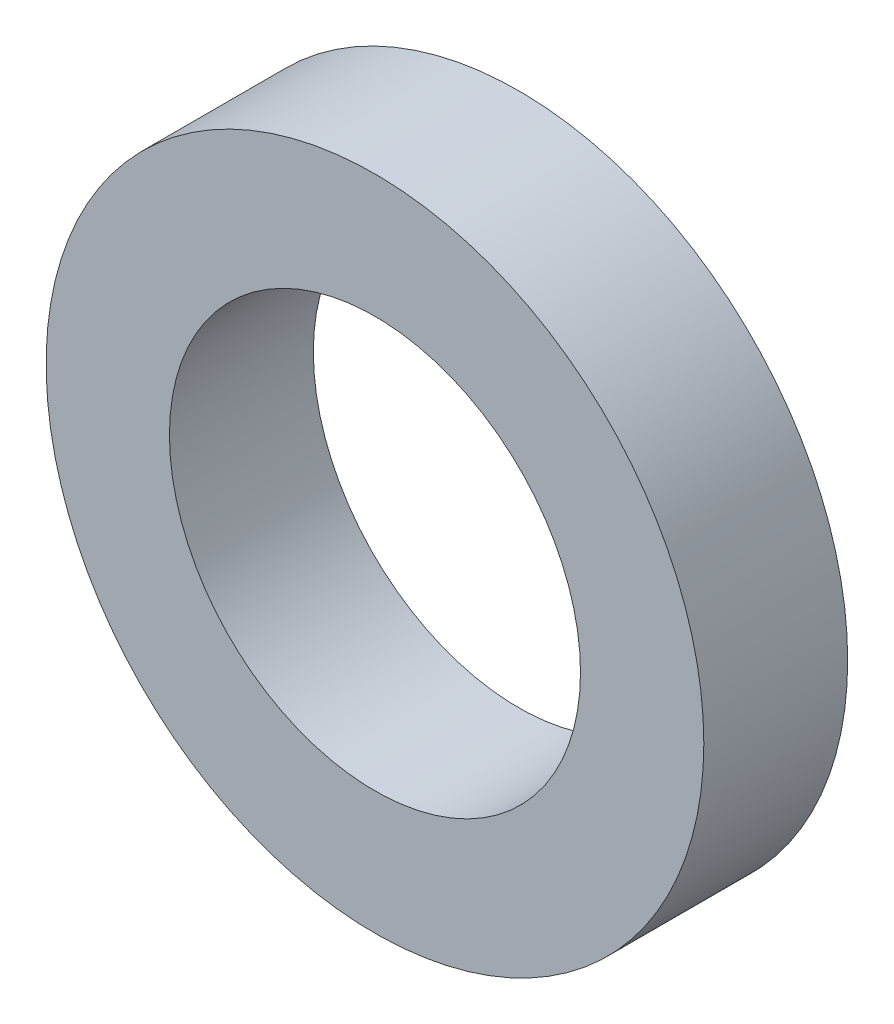
ISO-10303-21;
HEADER;
FILE_DESCRIPTION(('STEP AP214'),'2;1');
FILE_NAME('part.step','',(''),(''),'','','');
FILE_SCHEMA(('AUTOMOTIVE_DESIGN { 1 0 10303 214 1 1 1 1 }'));
ENDSEC;
DATA;
#1=APPLICATION_CONTEXT('core data for automotive mechanical design processes');
#2=APPLICATION_PROTOCOL_DEFINITION('international standard','automotive_design',2000,#1);
#3=PRODUCT_CONTEXT('',#1,'mechanical');
#4=PRODUCT('Part','Part','',(#3));
#5=PRODUCT_RELATED_PRODUCT_CATEGORY('part','',(#4));
#6=PRODUCT_DEFINITION_FORMATION('','',#4);
#7=PRODUCT_DEFINITION_CONTEXT('part definition',#1,'design');
#8=PRODUCT_DEFINITION('design','',#6,#7);
#9=PRODUCT_DEFINITION_SHAPE('','',#8);
#10=(LENGTH_UNIT() NAMED_UNIT(*) SI_UNIT(.MILLI.,.METRE.));
#11=(NAMED_UNIT(*) PLANE_ANGLE_UNIT() SI_UNIT($,.RADIAN.));
#12=(NAMED_UNIT(*) SI_UNIT($,.STERADIAN.) SOLID_ANGLE_UNIT());
#13=UNCERTAINTY_MEASURE_WITH_UNIT(LENGTH_MEASURE(1.E-05),#10,'distance_accuracy_value','');
#14=(GEOMETRIC_REPRESENTATION_CONTEXT(3) GLOBAL_UNCERTAINTY_ASSIGNED_CONTEXT((#13)) GLOBAL_UNIT_ASSIGNED_CONTEXT((#10,
#11,#12)) REPRESENTATION_CONTEXT('',''));
#15=CARTESIAN_POINT('',(0.,0.,0.));
#16=DIRECTION('',(0.,0.,1.));
#17=DIRECTION('',(1.,0.,0.));
#18=AXIS2_PLACEMENT_3D('',#15,#16,#17);
#19=CARTESIAN_POINT('',(0.,0.,7.));
#20=DIRECTION('',(0.,0.,1.));
#21=DIRECTION('',(1.,0.,0.));
#22=AXIS2_PLACEMENT_3D('',#19,#20,#21);
#23=PLANE('',#22);
#24=CARTESIAN_POINT('',(0.,0.,7.));
#25=DIRECTION('',(0.,0.,1.));
#26=DIRECTION('',(1.,0.,0.));
#27=AXIS2_PLACEMENT_3D('',#24,#25,#26);
#28=CIRCLE('',#27,16.);
#29=CARTESIAN_POINT('',(16.,0.,7.));
#30=VERTEX_POINT('',#29);
#31=EDGE_CURVE('E10',#30,#30,#28,.T.);
#32=ORIENTED_EDGE('',*,*,#31,.T.);
#33=EDGE_LOOP('',(#32));
#34=FACE_BOUND('',#33,.T.);
#35=CARTESIAN_POINT('',(0.,0.,7.));
#36=DIRECTION('',(0.,0.,1.));
#37=DIRECTION('',(1.,0.,0.));
#38=AXIS2_PLACEMENT_3D('',#35,#36,#37);
#39=CIRCLE('',#38,10.);
#40=CARTESIAN_POINT('',(10.,0.,7.));
#41=VERTEX_POINT('',#40);
#42=EDGE_CURVE('E41',#41,#41,#39,.T.);
#43=ORIENTED_EDGE('',*,*,#42,.F.);
#44=EDGE_LOOP('',(#43));
#45=FACE_BOUND('',#44,.T.);
#46=ADVANCED_FACE('F30',(#34,#45),#23,.T.);
#47=CARTESIAN_POINT('',(0.,0.,0.));
#48=DIRECTION('',(0.,0.,1.));
#49=DIRECTION('',(1.,0.,0.));
#50=AXIS2_PLACEMENT_3D('',#47,#48,#49);
#51=PLANE('',#50);
#52=CARTESIAN_POINT('',(0.,0.,0.));
#53=DIRECTION('',(0.,0.,1.));
#54=DIRECTION('',(1.,0.,0.));
#55=AXIS2_PLACEMENT_3D('',#52,#53,#54);
#56=CIRCLE('',#55,16.);
#57=CARTESIAN_POINT('',(16.,0.,0.));
#58=VERTEX_POINT('',#57);
#59=EDGE_CURVE('E34',#58,#58,#56,.T.);
#60=ORIENTED_EDGE('',*,*,#59,.F.);
#61=EDGE_LOOP('',(#60));
#62=FACE_BOUND('',#61,.T.);
#63=CARTESIAN_POINT('',(0.,0.,0.));
#64=DIRECTION('',(0.,0.,1.));
#65=DIRECTION('',(1.,0.,0.));
#66=AXIS2_PLACEMENT_3D('',#63,#64,#65);
#67=CIRCLE('',#66,10.);
#68=CARTESIAN_POINT('',(10.,0.,0.));
#69=VERTEX_POINT('',#68);
#70=EDGE_CURVE('E43',#69,#69,#67,.T.);
#71=ORIENTED_EDGE('',*,*,#70,.T.);
#72=EDGE_LOOP('',(#71));
#73=FACE_BOUND('',#72,.T.);
#74=ADVANCED_FACE('F53',(#62,#73),#51,.F.);
#75=CARTESIAN_POINT('',(0.,0.,7.));
#76=DIRECTION('',(0.,0.,-1.));
#77=DIRECTION('',(-1.,0.,0.));
#78=AXIS2_PLACEMENT_3D('',#75,#76,#77);
#79=CYLINDRICAL_SURFACE('',#78,16.);
#80=ORIENTED_EDGE('',*,*,#31,.F.);
#81=EDGE_LOOP('',(#80));
#82=FACE_BOUND('',#81,.T.);
#83=ORIENTED_EDGE('',*,*,#59,.T.);
#84=EDGE_LOOP('',(#83));
#85=FACE_BOUND('',#84,.T.);
#86=ADVANCED_FACE('F32',(#82,#85),#79,.T.);
#87=CARTESIAN_POINT('',(0.,0.,7.));
#88=DIRECTION('',(0.,0.,-1.));
#89=DIRECTION('',(-1.,0.,0.));
#90=AXIS2_PLACEMENT_3D('',#87,#88,#89);
#91=CYLINDRICAL_SURFACE('',#90,10.);
#92=ORIENTED_EDGE('',*,*,#42,.T.);
#93=EDGE_LOOP('',(#92));
#94=FACE_BOUND('',#93,.T.);
#95=ORIENTED_EDGE('',*,*,#70,.F.);
#96=EDGE_LOOP('',(#95));
#97=FACE_BOUND('',#96,.T.);
#98=ADVANCED_FACE('F49',(#94,#97),#91,.F.);
#99=CLOSED_SHELL('',(#46,#74,#86,#98));
#100=MANIFOLD_SOLID_BREP('B2',#99);
#101=ADVANCED_BREP_SHAPE_REPRESENTATION('',(#18,#100),#14);
#102=SHAPE_DEFINITION_REPRESENTATION(#9,#101);
ENDSEC;
END-ISO-10303-21;
